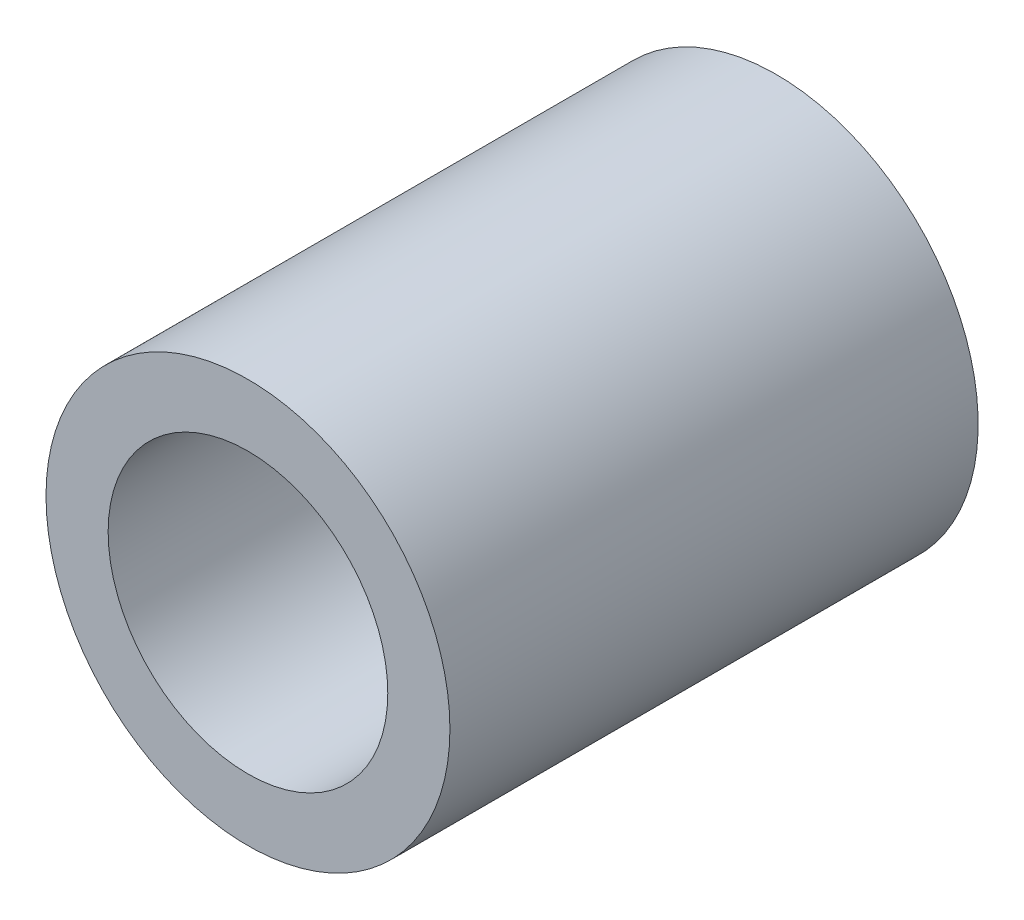
ISO-10303-21;
HEADER;
FILE_DESCRIPTION(('STEP AP214'),'2;1');
FILE_NAME('part.step','',(''),(''),'','','');
FILE_SCHEMA(('AUTOMOTIVE_DESIGN { 1 0 10303 214 1 1 1 1 }'));
ENDSEC;
DATA;
#1=APPLICATION_CONTEXT('core data for automotive mechanical design processes');
#2=APPLICATION_PROTOCOL_DEFINITION('international standard','automotive_design',2000,#1);
#3=PRODUCT_CONTEXT('',#1,'mechanical');
#4=PRODUCT('Part','Part','',(#3));
#5=PRODUCT_RELATED_PRODUCT_CATEGORY('part','',(#4));
#6=PRODUCT_DEFINITION_FORMATION('','',#4);
#7=PRODUCT_DEFINITION_CONTEXT('part definition',#1,'design');
#8=PRODUCT_DEFINITION('design','',#6,#7);
#9=PRODUCT_DEFINITION_SHAPE('','',#8);
#10=(LENGTH_UNIT() NAMED_UNIT(*) SI_UNIT(.MILLI.,.METRE.));
#11=(NAMED_UNIT(*) PLANE_ANGLE_UNIT() SI_UNIT($,.RADIAN.));
#12=(NAMED_UNIT(*) SI_UNIT($,.STERADIAN.) SOLID_ANGLE_UNIT());
#13=UNCERTAINTY_MEASURE_WITH_UNIT(LENGTH_MEASURE(1.E-05),#10,'distance_accuracy_value','');
#14=(GEOMETRIC_REPRESENTATION_CONTEXT(3) GLOBAL_UNCERTAINTY_ASSIGNED_CONTEXT((#13)) GLOBAL_UNIT_ASSIGNED_CONTEXT((#10,
#11,#12)) REPRESENTATION_CONTEXT('',''));
#15=CARTESIAN_POINT('',(0.,0.,0.));
#16=DIRECTION('',(0.,0.,1.));
#17=DIRECTION('',(1.,0.,0.));
#18=AXIS2_PLACEMENT_3D('',#15,#16,#17);
#19=CARTESIAN_POINT('',(0.,0.,15.));
#20=DIRECTION('',(0.,0.,-1.));
#21=DIRECTION('',(-1.,0.,0.));
#22=AXIS2_PLACEMENT_3D('',#19,#20,#21);
#23=CYLINDRICAL_SURFACE('',#22,4.5);
#24=CARTESIAN_POINT('',(0.,0.,15.));
#25=DIRECTION('',(0.,0.,1.));
#26=DIRECTION('',(1.,0.,0.));
#27=AXIS2_PLACEMENT_3D('',#24,#25,#26);
#28=CIRCLE('',#27,4.5);
#29=CARTESIAN_POINT('',(4.5,0.,15.));
#30=VERTEX_POINT('',#29);
#31=EDGE_CURVE('E38',#30,#30,#28,.T.);
#32=ORIENTED_EDGE('',*,*,#31,.T.);
#33=EDGE_LOOP('',(#32));
#34=FACE_BOUND('',#33,.T.);
#35=CARTESIAN_POINT('',(0.,0.,3.));
#36=DIRECTION('',(0.,0.,-1.));
#37=DIRECTION('',(-1.,0.,0.));
#38=AXIS2_PLACEMENT_3D('',#35,#36,#37);
#39=CIRCLE('',#38,4.5);
#40=CARTESIAN_POINT('',(-4.5,0.,3.));
#41=VERTEX_POINT('',#40);
#42=EDGE_CURVE('E34',#41,#41,#39,.T.);
#43=ORIENTED_EDGE('',*,*,#42,.T.);
#44=EDGE_LOOP('',(#43));
#45=FACE_BOUND('',#44,.T.);
#46=ADVANCED_FACE('F30',(#34,#45),#23,.F.);
#47=CARTESIAN_POINT('',(0.,0.,15.));
#48=DIRECTION('',(0.,0.,1.));
#49=DIRECTION('',(1.,0.,0.));
#50=AXIS2_PLACEMENT_3D('',#47,#48,#49);
#51=PLANE('',#50);
#52=CARTESIAN_POINT('',(0.,0.,15.));
#53=DIRECTION('',(0.,0.,1.));
#54=DIRECTION('',(1.,0.,0.));
#55=AXIS2_PLACEMENT_3D('',#52,#53,#54);
#56=CIRCLE('',#55,6.5);
#57=CARTESIAN_POINT('',(6.5,0.,15.));
#58=VERTEX_POINT('',#57);
#59=EDGE_CURVE('E10',#58,#58,#56,.T.);
#60=ORIENTED_EDGE('',*,*,#59,.T.);
#61=EDGE_LOOP('',(#60));
#62=FACE_BOUND('',#61,.T.);
#63=ORIENTED_EDGE('',*,*,#31,.F.);
#64=EDGE_LOOP('',(#63));
#65=FACE_BOUND('',#64,.T.);
#66=ADVANCED_FACE('F67',(#62,#65),#51,.T.);
#67=CARTESIAN_POINT('',(0.,0.,15.));
#68=DIRECTION('',(0.,0.,-1.));
#69=DIRECTION('',(-1.,0.,0.));
#70=AXIS2_PLACEMENT_3D('',#67,#68,#69);
#71=CYLINDRICAL_SURFACE('',#70,6.5);
#72=ORIENTED_EDGE('',*,*,#59,.F.);
#73=EDGE_LOOP('',(#72));
#74=FACE_BOUND('',#73,.T.);
#75=CARTESIAN_POINT('',(0.,0.,-2.));
#76=DIRECTION('',(0.,0.,-1.));
#77=DIRECTION('',(-1.,0.,0.));
#78=AXIS2_PLACEMENT_3D('',#75,#76,#77);
#79=CIRCLE('',#78,6.5);
#80=CARTESIAN_POINT('',(-6.5,0.,-2.));
#81=VERTEX_POINT('',#80);
#82=EDGE_CURVE('E47',#81,#81,#79,.T.);
#83=ORIENTED_EDGE('',*,*,#82,.F.);
#84=EDGE_LOOP('',(#83));
#85=FACE_BOUND('',#84,.T.);
#86=ADVANCED_FACE('F32',(#74,#85),#71,.T.);
#87=CARTESIAN_POINT('',(0.,0.,3.));
#88=DIRECTION('',(0.,0.,-1.));
#89=DIRECTION('',(-1.,0.,0.));
#90=AXIS2_PLACEMENT_3D('',#87,#88,#89);
#91=PLANE('',#90);
#92=CARTESIAN_POINT('',(0.,0.,3.));
#93=DIRECTION('',(0.,0.,-1.));
#94=DIRECTION('',(-1.,0.,0.));
#95=AXIS2_PLACEMENT_3D('',#92,#93,#94);
#96=CIRCLE('',#95,3.22316326936615);
#97=CARTESIAN_POINT('',(-3.22316326936615,0.,3.));
#98=VERTEX_POINT('',#97);
#99=EDGE_CURVE('E44',#98,#98,#96,.T.);
#100=ORIENTED_EDGE('',*,*,#99,.T.);
#101=EDGE_LOOP('',(#100));
#102=FACE_BOUND('',#101,.T.);
#103=ORIENTED_EDGE('',*,*,#42,.F.);
#104=EDGE_LOOP('',(#103));
#105=FACE_BOUND('',#104,.T.);
#106=ADVANCED_FACE('F63',(#102,#105),#91,.F.);
#107=CARTESIAN_POINT('',(0.,0.,3.));
#108=DIRECTION('',(0.,0.,-1.));
#109=DIRECTION('',(-1.,0.,0.));
#110=AXIS2_PLACEMENT_3D('',#107,#108,#109);
#111=CYLINDRICAL_SURFACE('',#110,3.22316326936615);
#112=ORIENTED_EDGE('',*,*,#99,.F.);
#113=EDGE_LOOP('',(#112));
#114=FACE_BOUND('',#113,.T.);
#115=CARTESIAN_POINT('',(0.,0.,-2.));
#116=DIRECTION('',(0.,0.,-1.));
#117=DIRECTION('',(-1.,0.,0.));
#118=AXIS2_PLACEMENT_3D('',#115,#116,#117);
#119=CIRCLE('',#118,3.22316326936615);
#120=CARTESIAN_POINT('',(-3.22316326936615,0.,-2.));
#121=VERTEX_POINT('',#120);
#122=EDGE_CURVE('E50',#121,#121,#119,.T.);
#123=ORIENTED_EDGE('',*,*,#122,.T.);
#124=EDGE_LOOP('',(#123));
#125=FACE_BOUND('',#124,.T.);
#126=ADVANCED_FACE('F54',(#114,#125),#111,.F.);
#127=CARTESIAN_POINT('',(0.,0.,-2.));
#128=DIRECTION('',(0.,0.,-1.));
#129=DIRECTION('',(-1.,0.,0.));
#130=AXIS2_PLACEMENT_3D('',#127,#128,#129);
#131=PLANE('',#130);
#132=ORIENTED_EDGE('',*,*,#82,.T.);
#133=EDGE_LOOP('',(#132));
#134=FACE_BOUND('',#133,.T.);
#135=ORIENTED_EDGE('',*,*,#122,.F.);
#136=EDGE_LOOP('',(#135));
#137=FACE_BOUND('',#136,.T.);
#138=ADVANCED_FACE('F56',(#134,#137),#131,.T.);
#139=CLOSED_SHELL('',(#46,#66,#86,#106,#126,#138));
#140=MANIFOLD_SOLID_BREP('B2',#139);
#141=ADVANCED_BREP_SHAPE_REPRESENTATION('',(#18,#140),#14);
#142=SHAPE_DEFINITION_REPRESENTATION(#9,#141);
ENDSEC;
END-ISO-10303-21;
